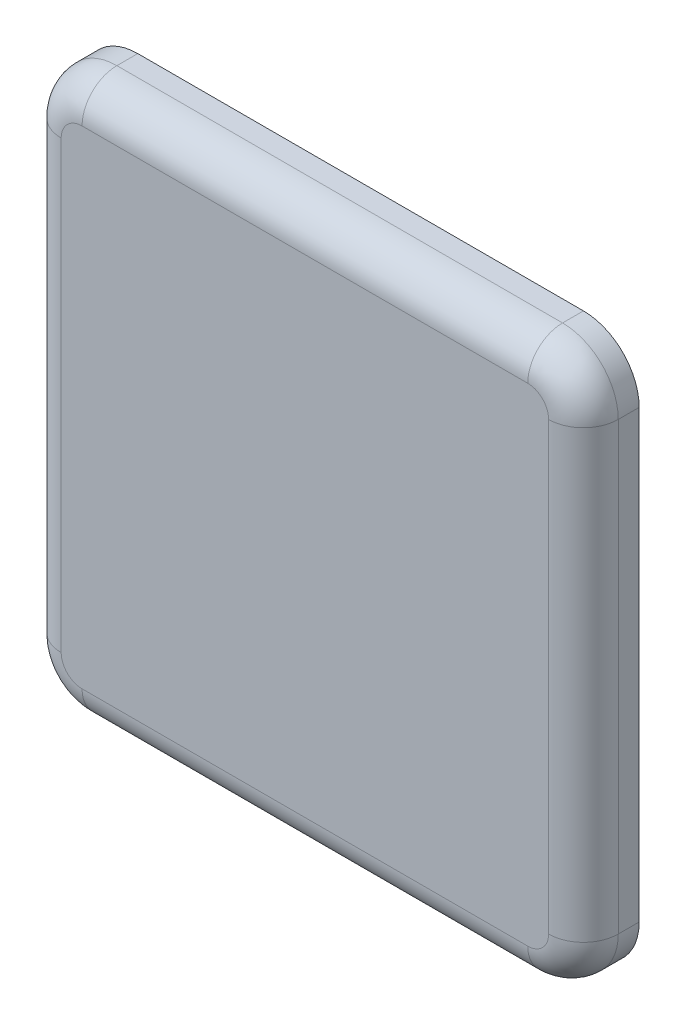
ISO-10303-21;
HEADER;
FILE_DESCRIPTION(('STEP AP214'),'2;1');
FILE_NAME('part.step','',(''),(''),'','','');
FILE_SCHEMA(('AUTOMOTIVE_DESIGN { 1 0 10303 214 1 1 1 1 }'));
ENDSEC;
DATA;
#1=APPLICATION_CONTEXT('core data for automotive mechanical design processes');
#2=APPLICATION_PROTOCOL_DEFINITION('international standard','automotive_design',2000,#1);
#3=PRODUCT_CONTEXT('',#1,'mechanical');
#4=PRODUCT('Part','Part','',(#3));
#5=PRODUCT_RELATED_PRODUCT_CATEGORY('part','',(#4));
#6=PRODUCT_DEFINITION_FORMATION('','',#4);
#7=PRODUCT_DEFINITION_CONTEXT('part definition',#1,'design');
#8=PRODUCT_DEFINITION('design','',#6,#7);
#9=PRODUCT_DEFINITION_SHAPE('','',#8);
#10=(LENGTH_UNIT() NAMED_UNIT(*) SI_UNIT(.MILLI.,.METRE.));
#11=(NAMED_UNIT(*) PLANE_ANGLE_UNIT() SI_UNIT($,.RADIAN.));
#12=(NAMED_UNIT(*) SI_UNIT($,.STERADIAN.) SOLID_ANGLE_UNIT());
#13=UNCERTAINTY_MEASURE_WITH_UNIT(LENGTH_MEASURE(1.E-05),#10,'distance_accuracy_value','');
#14=(GEOMETRIC_REPRESENTATION_CONTEXT(3) GLOBAL_UNCERTAINTY_ASSIGNED_CONTEXT((#13)) GLOBAL_UNIT_ASSIGNED_CONTEXT((#10,
#11,#12)) REPRESENTATION_CONTEXT('',''));
#15=CARTESIAN_POINT('',(0.,0.,0.));
#16=DIRECTION('',(0.,0.,1.));
#17=DIRECTION('',(1.,0.,0.));
#18=AXIS2_PLACEMENT_3D('',#15,#16,#17);
#19=CARTESIAN_POINT('',(36.75,36.,4.));
#20=DIRECTION('',(0.,0.,1.));
#21=DIRECTION('',(1.,0.,0.));
#22=AXIS2_PLACEMENT_3D('',#19,#20,#21);
#23=PLANE('',#22);
#24=DIRECTION('',(1.,0.,0.));
#25=VECTOR('',#24,1.);
#26=CARTESIAN_POINT('',(36.,2.5,4.));
#27=LINE('',#26,#25);
#28=CARTESIAN_POINT('',(36.,2.5,4.));
#29=VERTEX_POINT('',#28);
#30=CARTESIAN_POINT('',(4.,2.5,4.));
#31=VERTEX_POINT('',#30);
#32=EDGE_CURVE('E218',#29,#31,#27,.F.);
#33=ORIENTED_EDGE('',*,*,#32,.F.);
#34=CARTESIAN_POINT('',(36.,4.,4.));
#35=DIRECTION('',(0.,0.,-1.));
#36=DIRECTION('',(1.,0.,0.));
#37=AXIS2_PLACEMENT_3D('',#34,#35,#36);
#38=CIRCLE('',#37,1.49999999999999);
#39=CARTESIAN_POINT('',(37.5,4.,4.));
#40=VERTEX_POINT('',#39);
#41=EDGE_CURVE('E236',#40,#29,#38,.T.);
#42=ORIENTED_EDGE('',*,*,#41,.F.);
#43=DIRECTION('',(0.,1.,0.));
#44=VECTOR('',#43,1.);
#45=CARTESIAN_POINT('',(37.5,36.,4.));
#46=LINE('',#45,#44);
#47=CARTESIAN_POINT('',(37.5,36.,4.));
#48=VERTEX_POINT('',#47);
#49=EDGE_CURVE('E151',#48,#40,#46,.F.);
#50=ORIENTED_EDGE('',*,*,#49,.F.);
#51=CARTESIAN_POINT('',(36.,36.,4.));
#52=DIRECTION('',(0.,0.,-1.));
#53=DIRECTION('',(0.,1.,0.));
#54=AXIS2_PLACEMENT_3D('',#51,#52,#53);
#55=CIRCLE('',#54,1.5);
#56=CARTESIAN_POINT('',(36.,37.5,4.));
#57=VERTEX_POINT('',#56);
#58=EDGE_CURVE('E263',#57,#48,#55,.T.);
#59=ORIENTED_EDGE('',*,*,#58,.F.);
#60=DIRECTION('',(-1.,0.,0.));
#61=VECTOR('',#60,1.);
#62=CARTESIAN_POINT('',(4.,37.5,4.));
#63=LINE('',#62,#61);
#64=CARTESIAN_POINT('',(4.,37.5,4.));
#65=VERTEX_POINT('',#64);
#66=EDGE_CURVE('E139',#65,#57,#63,.F.);
#67=ORIENTED_EDGE('',*,*,#66,.F.);
#68=CARTESIAN_POINT('',(4.,36.,4.));
#69=DIRECTION('',(0.,0.,-1.));
#70=DIRECTION('',(-1.,0.,0.));
#71=AXIS2_PLACEMENT_3D('',#68,#69,#70);
#72=CIRCLE('',#71,1.5);
#73=CARTESIAN_POINT('',(2.5,36.,4.));
#74=VERTEX_POINT('',#73);
#75=EDGE_CURVE('E164',#74,#65,#72,.T.);
#76=ORIENTED_EDGE('',*,*,#75,.F.);
#77=DIRECTION('',(0.,-1.,0.));
#78=VECTOR('',#77,1.);
#79=CARTESIAN_POINT('',(2.5,4.,4.));
#80=LINE('',#79,#78);
#81=CARTESIAN_POINT('',(2.5,4.,4.));
#82=VERTEX_POINT('',#81);
#83=EDGE_CURVE('E169',#82,#74,#80,.F.);
#84=ORIENTED_EDGE('',*,*,#83,.F.);
#85=CARTESIAN_POINT('',(4.,4.,4.));
#86=DIRECTION('',(0.,0.,-1.));
#87=DIRECTION('',(0.,-1.,0.));
#88=AXIS2_PLACEMENT_3D('',#85,#86,#87);
#89=CIRCLE('',#88,1.5);
#90=EDGE_CURVE('E196',#31,#82,#89,.T.);
#91=ORIENTED_EDGE('',*,*,#90,.F.);
#92=EDGE_LOOP('',(#33,#42,#50,#59,#67,#76,#84,#91));
#93=FACE_BOUND('',#92,.T.);
#94=ADVANCED_FACE('F17',(#93),#23,.T.);
#95=CARTESIAN_POINT('',(37.5,36.,1.5));
#96=DIRECTION('',(0.,1.,0.));
#97=DIRECTION('',(0.,0.,1.));
#98=AXIS2_PLACEMENT_3D('',#95,#96,#97);
#99=CYLINDRICAL_SURFACE('',#98,2.5);
#100=CARTESIAN_POINT('',(37.5,36.,1.5));
#101=DIRECTION('',(0.,-1.,0.));
#102=DIRECTION('',(1.,0.,0.));
#103=AXIS2_PLACEMENT_3D('',#100,#101,#102);
#104=CIRCLE('',#103,2.5);
#105=CARTESIAN_POINT('',(40.,36.,1.5));
#106=VERTEX_POINT('',#105);
#107=EDGE_CURVE('E147',#48,#106,#104,.F.);
#108=ORIENTED_EDGE('',*,*,#107,.F.);
#109=ORIENTED_EDGE('',*,*,#49,.T.);
#110=CARTESIAN_POINT('',(37.5,4.,1.5));
#111=DIRECTION('',(0.,-1.,0.));
#112=DIRECTION('',(1.,0.,0.));
#113=AXIS2_PLACEMENT_3D('',#110,#111,#112);
#114=CIRCLE('',#113,2.5);
#115=CARTESIAN_POINT('',(40.,4.,1.5));
#116=VERTEX_POINT('',#115);
#117=EDGE_CURVE('E154',#116,#40,#114,.T.);
#118=ORIENTED_EDGE('',*,*,#117,.F.);
#119=DIRECTION('',(0.,1.,0.));
#120=VECTOR('',#119,1.);
#121=CARTESIAN_POINT('',(40.,36.,1.5));
#122=LINE('',#121,#120);
#123=EDGE_CURVE('E118',#106,#116,#122,.F.);
#124=ORIENTED_EDGE('',*,*,#123,.F.);
#125=EDGE_LOOP('',(#108,#109,#118,#124));
#126=FACE_BOUND('',#125,.T.);
#127=ADVANCED_FACE('F250',(#126),#99,.T.);
#128=CARTESIAN_POINT('',(34.5,4.,1.5));
#129=DIRECTION('',(0.,1.,0.));
#130=DIRECTION('',(-1.,0.,0.));
#131=AXIS2_PLACEMENT_3D('',#128,#129,#130);
#132=CIRCLE('',#131,2.5);
#133=TRIMMED_CURVE('',#132,(PARAMETER_VALUE(-2.21429743558818)),
(PARAMETER_VALUE(2.21429743558818)),.T.,.PARAMETER.);
#134=CARTESIAN_POINT('',(36.,4.,1.5));
#135=DIRECTION('',(0.,0.,-1.));
#136=AXIS1_PLACEMENT('',#134,#135);
#137=SURFACE_OF_REVOLUTION('',#133,#136);
#138=CARTESIAN_POINT('',(36.,2.5,1.5));
#139=DIRECTION('',(1.,0.,0.));
#140=DIRECTION('',(0.,0.,-1.));
#141=AXIS2_PLACEMENT_3D('',#138,#139,#140);
#142=CIRCLE('',#141,2.5);
#143=CARTESIAN_POINT('',(36.,0.,1.5));
#144=VERTEX_POINT('',#143);
#145=EDGE_CURVE('E226',#144,#29,#142,.F.);
#146=ORIENTED_EDGE('',*,*,#145,.F.);
#147=CARTESIAN_POINT('',(36.,4.,1.5));
#148=DIRECTION('',(0.,0.,1.));
#149=DIRECTION('',(1.,0.,0.));
#150=AXIS2_PLACEMENT_3D('',#147,#148,#149);
#151=CIRCLE('',#150,4.);
#152=EDGE_CURVE('E74',#116,#144,#151,.F.);
#153=ORIENTED_EDGE('',*,*,#152,.F.);
#154=ORIENTED_EDGE('',*,*,#117,.T.);
#155=ORIENTED_EDGE('',*,*,#41,.T.);
#156=EDGE_LOOP('',(#146,#153,#154,#155));
#157=FACE_BOUND('',#156,.T.);
#158=ADVANCED_FACE('F241',(#157),#137,.F.);
#159=CARTESIAN_POINT('',(36.,2.5,1.5));
#160=DIRECTION('',(1.,0.,0.));
#161=DIRECTION('',(0.,0.,-1.));
#162=AXIS2_PLACEMENT_3D('',#159,#160,#161);
#163=CYLINDRICAL_SURFACE('',#162,2.5);
#164=ORIENTED_EDGE('',*,*,#145,.T.);
#165=ORIENTED_EDGE('',*,*,#32,.T.);
#166=CARTESIAN_POINT('',(4.,2.5,1.5));
#167=DIRECTION('',(-1.,0.,0.));
#168=DIRECTION('',(0.,-1.,0.));
#169=AXIS2_PLACEMENT_3D('',#166,#167,#168);
#170=CIRCLE('',#169,2.5);
#171=CARTESIAN_POINT('',(4.,0.,1.5));
#172=VERTEX_POINT('',#171);
#173=EDGE_CURVE('E203',#172,#31,#170,.T.);
#174=ORIENTED_EDGE('',*,*,#173,.F.);
#175=DIRECTION('',(1.,0.,0.));
#176=VECTOR('',#175,1.);
#177=CARTESIAN_POINT('',(36.,0.,1.5));
#178=LINE('',#177,#176);
#179=EDGE_CURVE('E78',#144,#172,#178,.F.);
#180=ORIENTED_EDGE('',*,*,#179,.F.);
#181=EDGE_LOOP('',(#164,#165,#174,#180));
#182=FACE_BOUND('',#181,.T.);
#183=ADVANCED_FACE('F209',(#182),#163,.T.);
#184=CARTESIAN_POINT('',(2.5,4.,1.5));
#185=DIRECTION('',(0.,1.,0.));
#186=DIRECTION('',(-1.,0.,0.));
#187=AXIS2_PLACEMENT_3D('',#184,#185,#186);
#188=CIRCLE('',#187,2.5);
#189=TRIMMED_CURVE('',#188,(PARAMETER_VALUE(-2.21429743558818)),
(PARAMETER_VALUE(2.21429743558818)),.T.,.PARAMETER.);
#190=CARTESIAN_POINT('',(4.,4.,1.5));
#191=DIRECTION('',(0.,0.,-1.));
#192=AXIS1_PLACEMENT('',#190,#191);
#193=SURFACE_OF_REVOLUTION('',#189,#192);
#194=ORIENTED_EDGE('',*,*,#173,.T.);
#195=ORIENTED_EDGE('',*,*,#90,.T.);
#196=CARTESIAN_POINT('',(2.5,4.,1.5));
#197=DIRECTION('',(0.,-1.,0.));
#198=DIRECTION('',(0.,0.,-1.));
#199=AXIS2_PLACEMENT_3D('',#196,#197,#198);
#200=CIRCLE('',#199,2.5);
#201=CARTESIAN_POINT('',(0.,4.,1.5));
#202=VERTEX_POINT('',#201);
#203=EDGE_CURVE('E193',#202,#82,#200,.F.);
#204=ORIENTED_EDGE('',*,*,#203,.F.);
#205=CARTESIAN_POINT('',(4.,4.,1.5));
#206=DIRECTION('',(0.,0.,1.));
#207=DIRECTION('',(1.,0.,0.));
#208=AXIS2_PLACEMENT_3D('',#205,#206,#207);
#209=CIRCLE('',#208,4.);
#210=EDGE_CURVE('E115',#172,#202,#209,.F.);
#211=ORIENTED_EDGE('',*,*,#210,.F.);
#212=EDGE_LOOP('',(#194,#195,#204,#211));
#213=FACE_BOUND('',#212,.T.);
#214=ADVANCED_FACE('F205',(#213),#193,.F.);
#215=CARTESIAN_POINT('',(2.5,4.,1.5));
#216=DIRECTION('',(0.,-1.,0.));
#217=DIRECTION('',(0.,0.,-1.));
#218=AXIS2_PLACEMENT_3D('',#215,#216,#217);
#219=CYLINDRICAL_SURFACE('',#218,2.5);
#220=ORIENTED_EDGE('',*,*,#203,.T.);
#221=ORIENTED_EDGE('',*,*,#83,.T.);
#222=CARTESIAN_POINT('',(2.5,36.,1.5));
#223=DIRECTION('',(0.,1.,0.));
#224=DIRECTION('',(-1.,0.,0.));
#225=AXIS2_PLACEMENT_3D('',#222,#223,#224);
#226=CIRCLE('',#225,2.5);
#227=CARTESIAN_POINT('',(0.,36.,1.5));
#228=VERTEX_POINT('',#227);
#229=EDGE_CURVE('E187',#228,#74,#226,.T.);
#230=ORIENTED_EDGE('',*,*,#229,.F.);
#231=DIRECTION('',(0.,1.,0.));
#232=VECTOR('',#231,1.);
#233=CARTESIAN_POINT('',(0.,4.,1.5));
#234=LINE('',#233,#232);
#235=EDGE_CURVE('E111',#202,#228,#234,.T.);
#236=ORIENTED_EDGE('',*,*,#235,.F.);
#237=EDGE_LOOP('',(#220,#221,#230,#236));
#238=FACE_BOUND('',#237,.T.);
#239=ADVANCED_FACE('F181',(#238),#219,.T.);
#240=CARTESIAN_POINT('',(2.5,36.,1.5));
#241=DIRECTION('',(0.,1.,0.));
#242=DIRECTION('',(-1.,0.,0.));
#243=AXIS2_PLACEMENT_3D('',#240,#241,#242);
#244=CIRCLE('',#243,2.5);
#245=TRIMMED_CURVE('',#244,(PARAMETER_VALUE(-2.21429743558818)),
(PARAMETER_VALUE(2.21429743558818)),.T.,.PARAMETER.);
#246=CARTESIAN_POINT('',(4.,36.,1.5));
#247=DIRECTION('',(0.,0.,-1.));
#248=AXIS1_PLACEMENT('',#246,#247);
#249=SURFACE_OF_REVOLUTION('',#245,#248);
#250=ORIENTED_EDGE('',*,*,#229,.T.);
#251=ORIENTED_EDGE('',*,*,#75,.T.);
#252=CARTESIAN_POINT('',(4.,37.5,1.5));
#253=DIRECTION('',(-1.,0.,0.));
#254=DIRECTION('',(0.,0.,1.));
#255=AXIS2_PLACEMENT_3D('',#252,#253,#254);
#256=CIRCLE('',#255,2.5);
#257=CARTESIAN_POINT('',(4.,40.,1.5));
#258=VERTEX_POINT('',#257);
#259=EDGE_CURVE('E148',#258,#65,#256,.F.);
#260=ORIENTED_EDGE('',*,*,#259,.F.);
#261=CARTESIAN_POINT('',(4.,36.,1.5));
#262=DIRECTION('',(0.,0.,1.));
#263=DIRECTION('',(1.,0.,0.));
#264=AXIS2_PLACEMENT_3D('',#261,#262,#263);
#265=CIRCLE('',#264,4.);
#266=EDGE_CURVE('E107',#228,#258,#265,.F.);
#267=ORIENTED_EDGE('',*,*,#266,.F.);
#268=EDGE_LOOP('',(#250,#251,#260,#267));
#269=FACE_BOUND('',#268,.T.);
#270=ADVANCED_FACE('F171',(#269),#249,.F.);
#271=CARTESIAN_POINT('',(4.,37.5,1.5));
#272=DIRECTION('',(-1.,0.,0.));
#273=DIRECTION('',(0.,0.,1.));
#274=AXIS2_PLACEMENT_3D('',#271,#272,#273);
#275=CYLINDRICAL_SURFACE('',#274,2.5);
#276=ORIENTED_EDGE('',*,*,#259,.T.);
#277=ORIENTED_EDGE('',*,*,#66,.T.);
#278=CARTESIAN_POINT('',(36.,37.5,1.5));
#279=DIRECTION('',(1.,0.,0.));
#280=DIRECTION('',(0.,1.,0.));
#281=AXIS2_PLACEMENT_3D('',#278,#279,#280);
#282=CIRCLE('',#281,2.5);
#283=CARTESIAN_POINT('',(36.,40.,1.5));
#284=VERTEX_POINT('',#283);
#285=EDGE_CURVE('E315',#284,#57,#282,.T.);
#286=ORIENTED_EDGE('',*,*,#285,.F.);
#287=DIRECTION('',(1.,0.,0.));
#288=VECTOR('',#287,1.);
#289=CARTESIAN_POINT('',(4.,40.,1.5));
#290=LINE('',#289,#288);
#291=EDGE_CURVE('E102',#258,#284,#290,.T.);
#292=ORIENTED_EDGE('',*,*,#291,.F.);
#293=EDGE_LOOP('',(#276,#277,#286,#292));
#294=FACE_BOUND('',#293,.T.);
#295=ADVANCED_FACE('F128',(#294),#275,.T.);
#296=CARTESIAN_POINT('',(34.5,36.,1.5));
#297=DIRECTION('',(0.,1.,0.));
#298=DIRECTION('',(-1.,0.,0.));
#299=AXIS2_PLACEMENT_3D('',#296,#297,#298);
#300=CIRCLE('',#299,2.5);
#301=TRIMMED_CURVE('',#300,(PARAMETER_VALUE(-2.21429743558818)),
(PARAMETER_VALUE(2.21429743558818)),.T.,.PARAMETER.);
#302=CARTESIAN_POINT('',(36.,36.,1.5));
#303=DIRECTION('',(0.,0.,-1.));
#304=AXIS1_PLACEMENT('',#302,#303);
#305=SURFACE_OF_REVOLUTION('',#301,#304);
#306=ORIENTED_EDGE('',*,*,#285,.T.);
#307=ORIENTED_EDGE('',*,*,#58,.T.);
#308=ORIENTED_EDGE('',*,*,#107,.T.);
#309=CARTESIAN_POINT('',(36.,36.,1.5));
#310=DIRECTION('',(0.,0.,1.));
#311=DIRECTION('',(1.,0.,0.));
#312=AXIS2_PLACEMENT_3D('',#309,#310,#311);
#313=CIRCLE('',#312,4.);
#314=EDGE_CURVE('E93',#284,#106,#313,.F.);
#315=ORIENTED_EDGE('',*,*,#314,.F.);
#316=EDGE_LOOP('',(#306,#307,#308,#315));
#317=FACE_BOUND('',#316,.T.);
#318=ADVANCED_FACE('F122',(#317),#305,.F.);
#319=CARTESIAN_POINT('',(40.,36.,1.5));
#320=DIRECTION('',(1.,0.,0.));
#321=DIRECTION('',(0.,0.,-1.));
#322=AXIS2_PLACEMENT_3D('',#319,#320,#321);
#323=PLANE('',#322);
#324=DIRECTION('',(0.,0.,1.));
#325=VECTOR('',#324,1.);
#326=CARTESIAN_POINT('',(40.,36.,0.75));
#327=LINE('',#326,#325);
#328=CARTESIAN_POINT('',(40.,36.,0.));
#329=VERTEX_POINT('',#328);
#330=EDGE_CURVE('E99',#106,#329,#327,.F.);
#331=ORIENTED_EDGE('',*,*,#330,.F.);
#332=ORIENTED_EDGE('',*,*,#123,.T.);
#333=DIRECTION('',(0.,0.,1.));
#334=VECTOR('',#333,1.);
#335=CARTESIAN_POINT('',(40.,4.,0.75));
#336=LINE('',#335,#334);
#337=CARTESIAN_POINT('',(40.,4.,0.));
#338=VERTEX_POINT('',#337);
#339=EDGE_CURVE('E61',#338,#116,#336,.T.);
#340=ORIENTED_EDGE('',*,*,#339,.F.);
#341=DIRECTION('',(0.,1.,0.));
#342=VECTOR('',#341,1.);
#343=CARTESIAN_POINT('',(40.,36.,0.));
#344=LINE('',#343,#342);
#345=EDGE_CURVE('E92',#329,#338,#344,.F.);
#346=ORIENTED_EDGE('',*,*,#345,.F.);
#347=EDGE_LOOP('',(#331,#332,#340,#346));
#348=FACE_BOUND('',#347,.T.);
#349=ADVANCED_FACE('F127',(#348),#323,.T.);
#350=CARTESIAN_POINT('',(36.,4.,0.75));
#351=DIRECTION('',(0.,0.,1.));
#352=DIRECTION('',(1.,0.,0.));
#353=AXIS2_PLACEMENT_3D('',#350,#351,#352);
#354=CYLINDRICAL_SURFACE('',#353,4.);
#355=DIRECTION('',(0.,0.,-1.));
#356=VECTOR('',#355,1.);
#357=CARTESIAN_POINT('',(36.,0.,1.5));
#358=LINE('',#357,#356);
#359=CARTESIAN_POINT('',(36.,0.,0.));
#360=VERTEX_POINT('',#359);
#361=EDGE_CURVE('E67',#360,#144,#358,.F.);
#362=ORIENTED_EDGE('',*,*,#361,.F.);
#363=CARTESIAN_POINT('',(36.,4.,0.));
#364=DIRECTION('',(0.,0.,1.));
#365=DIRECTION('',(1.,0.,0.));
#366=AXIS2_PLACEMENT_3D('',#363,#364,#365);
#367=CIRCLE('',#366,4.);
#368=EDGE_CURVE('E21',#338,#360,#367,.F.);
#369=ORIENTED_EDGE('',*,*,#368,.F.);
#370=ORIENTED_EDGE('',*,*,#339,.T.);
#371=ORIENTED_EDGE('',*,*,#152,.T.);
#372=EDGE_LOOP('',(#362,#369,#370,#371));
#373=FACE_BOUND('',#372,.T.);
#374=ADVANCED_FACE('F69',(#373),#354,.T.);
#375=CARTESIAN_POINT('',(36.,0.,1.5));
#376=DIRECTION('',(0.,-1.,0.));
#377=DIRECTION('',(0.,0.,-1.));
#378=AXIS2_PLACEMENT_3D('',#375,#376,#377);
#379=PLANE('',#378);
#380=ORIENTED_EDGE('',*,*,#361,.T.);
#381=ORIENTED_EDGE('',*,*,#179,.T.);
#382=DIRECTION('',(0.,0.,1.));
#383=VECTOR('',#382,1.);
#384=CARTESIAN_POINT('',(4.,0.,0.75));
#385=LINE('',#384,#383);
#386=CARTESIAN_POINT('',(4.,0.,0.));
#387=VERTEX_POINT('',#386);
#388=EDGE_CURVE('E84',#387,#172,#385,.T.);
#389=ORIENTED_EDGE('',*,*,#388,.F.);
#390=DIRECTION('',(-1.,0.,0.));
#391=VECTOR('',#390,1.);
#392=CARTESIAN_POINT('',(38.,0.,0.));
#393=LINE('',#392,#391);
#394=EDGE_CURVE('E81',#360,#387,#393,.T.);
#395=ORIENTED_EDGE('',*,*,#394,.F.);
#396=EDGE_LOOP('',(#380,#381,#389,#395));
#397=FACE_BOUND('',#396,.T.);
#398=ADVANCED_FACE('F82',(#397),#379,.T.);
#399=CARTESIAN_POINT('',(4.,4.,0.75));
#400=DIRECTION('',(0.,0.,1.));
#401=DIRECTION('',(1.,0.,0.));
#402=AXIS2_PLACEMENT_3D('',#399,#400,#401);
#403=CYLINDRICAL_SURFACE('',#402,4.);
#404=ORIENTED_EDGE('',*,*,#388,.T.);
#405=ORIENTED_EDGE('',*,*,#210,.T.);
#406=DIRECTION('',(0.,0.,1.));
#407=VECTOR('',#406,1.);
#408=CARTESIAN_POINT('',(0.,4.,1.5));
#409=LINE('',#408,#407);
#410=CARTESIAN_POINT('',(0.,4.,0.));
#411=VERTEX_POINT('',#410);
#412=EDGE_CURVE('E112',#411,#202,#409,.T.);
#413=ORIENTED_EDGE('',*,*,#412,.F.);
#414=CARTESIAN_POINT('',(4.,4.,0.));
#415=DIRECTION('',(0.,0.,1.));
#416=DIRECTION('',(1.,0.,0.));
#417=AXIS2_PLACEMENT_3D('',#414,#415,#416);
#418=CIRCLE('',#417,4.);
#419=EDGE_CURVE('E88',#387,#411,#418,.F.);
#420=ORIENTED_EDGE('',*,*,#419,.F.);
#421=EDGE_LOOP('',(#404,#405,#413,#420));
#422=FACE_BOUND('',#421,.T.);
#423=ADVANCED_FACE('F368',(#422),#403,.T.);
#424=CARTESIAN_POINT('',(0.,4.,1.5));
#425=DIRECTION('',(-1.,0.,0.));
#426=DIRECTION('',(0.,0.,1.));
#427=AXIS2_PLACEMENT_3D('',#424,#425,#426);
#428=PLANE('',#427);
#429=ORIENTED_EDGE('',*,*,#412,.T.);
#430=ORIENTED_EDGE('',*,*,#235,.T.);
#431=DIRECTION('',(0.,0.,1.));
#432=VECTOR('',#431,1.);
#433=CARTESIAN_POINT('',(0.,36.,0.75));
#434=LINE('',#433,#432);
#435=CARTESIAN_POINT('',(0.,36.,0.));
#436=VERTEX_POINT('',#435);
#437=EDGE_CURVE('E108',#436,#228,#434,.T.);
#438=ORIENTED_EDGE('',*,*,#437,.F.);
#439=DIRECTION('',(0.,1.,0.));
#440=VECTOR('',#439,1.);
#441=CARTESIAN_POINT('',(0.,36.,0.));
#442=LINE('',#441,#440);
#443=EDGE_CURVE('E346',#411,#436,#442,.T.);
#444=ORIENTED_EDGE('',*,*,#443,.F.);
#445=EDGE_LOOP('',(#429,#430,#438,#444));
#446=FACE_BOUND('',#445,.T.);
#447=ADVANCED_FACE('F345',(#446),#428,.T.);
#448=CARTESIAN_POINT('',(4.,36.,0.75));
#449=DIRECTION('',(0.,0.,1.));
#450=DIRECTION('',(1.,0.,0.));
#451=AXIS2_PLACEMENT_3D('',#448,#449,#450);
#452=CYLINDRICAL_SURFACE('',#451,4.);
#453=ORIENTED_EDGE('',*,*,#437,.T.);
#454=ORIENTED_EDGE('',*,*,#266,.T.);
#455=DIRECTION('',(0.,0.,1.));
#456=VECTOR('',#455,1.);
#457=CARTESIAN_POINT('',(4.,40.,1.5));
#458=LINE('',#457,#456);
#459=CARTESIAN_POINT('',(4.,40.,0.));
#460=VERTEX_POINT('',#459);
#461=EDGE_CURVE('E104',#460,#258,#458,.T.);
#462=ORIENTED_EDGE('',*,*,#461,.F.);
#463=CARTESIAN_POINT('',(4.,36.,0.));
#464=DIRECTION('',(0.,0.,1.));
#465=DIRECTION('',(1.,0.,0.));
#466=AXIS2_PLACEMENT_3D('',#463,#464,#465);
#467=CIRCLE('',#466,4.);
#468=EDGE_CURVE('E338',#436,#460,#467,.F.);
#469=ORIENTED_EDGE('',*,*,#468,.F.);
#470=EDGE_LOOP('',(#453,#454,#462,#469));
#471=FACE_BOUND('',#470,.T.);
#472=ADVANCED_FACE('F335',(#471),#452,.T.);
#473=CARTESIAN_POINT('',(4.,40.,1.5));
#474=DIRECTION('',(0.,1.,0.));
#475=DIRECTION('',(0.,0.,1.));
#476=AXIS2_PLACEMENT_3D('',#473,#474,#475);
#477=PLANE('',#476);
#478=ORIENTED_EDGE('',*,*,#461,.T.);
#479=ORIENTED_EDGE('',*,*,#291,.T.);
#480=DIRECTION('',(0.,0.,1.));
#481=VECTOR('',#480,1.);
#482=CARTESIAN_POINT('',(36.,40.,0.75));
#483=LINE('',#482,#481);
#484=CARTESIAN_POINT('',(36.,40.,0.));
#485=VERTEX_POINT('',#484);
#486=EDGE_CURVE('E36',#485,#284,#483,.T.);
#487=ORIENTED_EDGE('',*,*,#486,.F.);
#488=DIRECTION('',(-1.,0.,0.));
#489=VECTOR('',#488,1.);
#490=CARTESIAN_POINT('',(38.,40.,0.));
#491=LINE('',#490,#489);
#492=EDGE_CURVE('E27',#460,#485,#491,.F.);
#493=ORIENTED_EDGE('',*,*,#492,.F.);
#494=EDGE_LOOP('',(#478,#479,#487,#493));
#495=FACE_BOUND('',#494,.T.);
#496=ADVANCED_FACE('F370',(#495),#477,.T.);
#497=CARTESIAN_POINT('',(36.,36.,0.75));
#498=DIRECTION('',(0.,0.,1.));
#499=DIRECTION('',(1.,0.,0.));
#500=AXIS2_PLACEMENT_3D('',#497,#498,#499);
#501=CYLINDRICAL_SURFACE('',#500,4.);
#502=ORIENTED_EDGE('',*,*,#486,.T.);
#503=ORIENTED_EDGE('',*,*,#314,.T.);
#504=ORIENTED_EDGE('',*,*,#330,.T.);
#505=CARTESIAN_POINT('',(36.,36.,0.));
#506=DIRECTION('',(0.,0.,1.));
#507=DIRECTION('',(1.,0.,0.));
#508=AXIS2_PLACEMENT_3D('',#505,#506,#507);
#509=CIRCLE('',#508,4.);
#510=EDGE_CURVE('E11',#485,#329,#509,.F.);
#511=ORIENTED_EDGE('',*,*,#510,.F.);
#512=EDGE_LOOP('',(#502,#503,#504,#511));
#513=FACE_BOUND('',#512,.T.);
#514=ADVANCED_FACE('F374',(#513),#501,.T.);
#515=CARTESIAN_POINT('',(38.,36.,0.));
#516=DIRECTION('',(0.,0.,-1.));
#517=DIRECTION('',(-1.,0.,0.));
#518=AXIS2_PLACEMENT_3D('',#515,#516,#517);
#519=PLANE('',#518);
#520=ORIENTED_EDGE('',*,*,#492,.T.);
#521=ORIENTED_EDGE('',*,*,#510,.T.);
#522=ORIENTED_EDGE('',*,*,#345,.T.);
#523=ORIENTED_EDGE('',*,*,#368,.T.);
#524=ORIENTED_EDGE('',*,*,#394,.T.);
#525=ORIENTED_EDGE('',*,*,#419,.T.);
#526=ORIENTED_EDGE('',*,*,#443,.T.);
#527=ORIENTED_EDGE('',*,*,#468,.T.);
#528=EDGE_LOOP('',(#520,#521,#522,#523,#524,#525,#526,#527));
#529=FACE_BOUND('',#528,.T.);
#530=ADVANCED_FACE('F91',(#529),#519,.T.);
#531=CLOSED_SHELL('',(#94,#127,#158,#183,#214,#239,#270,#295,#318,#349,#374,#398,#423,#447,#472,
#496,#514,#530));
#532=MANIFOLD_SOLID_BREP('B1',#531);
#533=ADVANCED_BREP_SHAPE_REPRESENTATION('',(#18,#532),#14);
#534=SHAPE_DEFINITION_REPRESENTATION(#9,#533);
ENDSEC;
END-ISO-10303-21;
